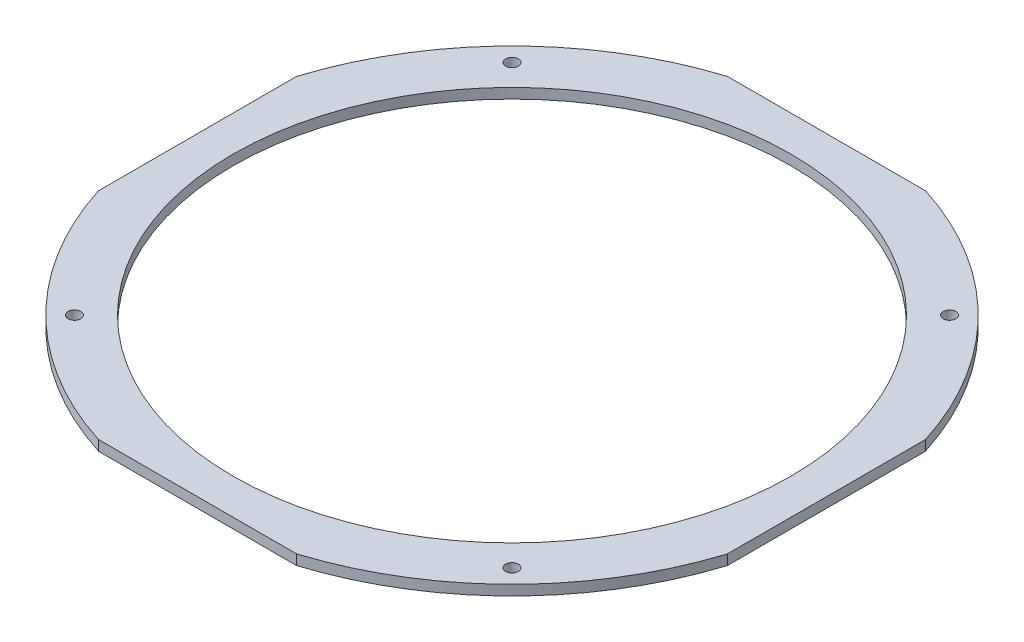
ISO-10303-21;
HEADER;
FILE_DESCRIPTION(('STEP AP214'),'2;1');
FILE_NAME('part.step','',(''),(''),'','','');
FILE_SCHEMA(('AUTOMOTIVE_DESIGN { 1 0 10303 214 1 1 1 1 }'));
ENDSEC;
DATA;
#1=APPLICATION_CONTEXT('core data for automotive mechanical design processes');
#2=APPLICATION_PROTOCOL_DEFINITION('international standard','automotive_design',2000,#1);
#3=PRODUCT_CONTEXT('',#1,'mechanical');
#4=PRODUCT('Part','Part','',(#3));
#5=PRODUCT_RELATED_PRODUCT_CATEGORY('part','',(#4));
#6=PRODUCT_DEFINITION_FORMATION('','',#4);
#7=PRODUCT_DEFINITION_CONTEXT('part definition',#1,'design');
#8=PRODUCT_DEFINITION('design','',#6,#7);
#9=PRODUCT_DEFINITION_SHAPE('','',#8);
#10=(LENGTH_UNIT() NAMED_UNIT(*) SI_UNIT(.MILLI.,.METRE.));
#11=(NAMED_UNIT(*) PLANE_ANGLE_UNIT() SI_UNIT($,.RADIAN.));
#12=(NAMED_UNIT(*) SI_UNIT($,.STERADIAN.) SOLID_ANGLE_UNIT());
#13=UNCERTAINTY_MEASURE_WITH_UNIT(LENGTH_MEASURE(1.E-05),#10,'distance_accuracy_value','');
#14=(GEOMETRIC_REPRESENTATION_CONTEXT(3) GLOBAL_UNCERTAINTY_ASSIGNED_CONTEXT((#13)) GLOBAL_UNIT_ASSIGNED_CONTEXT((#10,
#11,#12)) REPRESENTATION_CONTEXT('',''));
#15=CARTESIAN_POINT('',(0.,0.,0.));
#16=DIRECTION('',(0.,0.,1.));
#17=DIRECTION('',(1.,0.,0.));
#18=AXIS2_PLACEMENT_3D('',#15,#16,#17);
#19=CARTESIAN_POINT('',(0.,2.,0.));
#20=DIRECTION('',(0.,1.,0.));
#21=DIRECTION('',(0.,0.,1.));
#22=AXIS2_PLACEMENT_3D('',#19,#20,#21);
#23=PLANE('',#22);
#24=CARTESIAN_POINT('',(43.1335136523798,2.,-43.1335136523789));
#25=DIRECTION('',(0.,1.,0.));
#26=DIRECTION('',(0.,0.,1.));
#27=AXIS2_PLACEMENT_3D('',#24,#25,#26);
#28=CIRCLE('',#27,1.25);
#29=CARTESIAN_POINT('',(43.1335136523798,2.,-41.8835136523789));
#30=VERTEX_POINT('',#29);
#31=EDGE_CURVE('E236',#30,#30,#28,.T.);
#32=ORIENTED_EDGE('',*,*,#31,.F.);
#33=EDGE_LOOP('',(#32));
#34=FACE_BOUND('',#33,.T.);
#35=CARTESIAN_POINT('',(-43.1335136523791,2.,-43.1335136523797));
#36=DIRECTION('',(0.,1.,0.));
#37=DIRECTION('',(0.,0.,1.));
#38=AXIS2_PLACEMENT_3D('',#35,#36,#37);
#39=CIRCLE('',#38,1.25);
#40=CARTESIAN_POINT('',(-43.1335136523791,2.,-41.8835136523797));
#41=VERTEX_POINT('',#40);
#42=EDGE_CURVE('E240',#41,#41,#39,.T.);
#43=ORIENTED_EDGE('',*,*,#42,.F.);
#44=EDGE_LOOP('',(#43));
#45=FACE_BOUND('',#44,.T.);
#46=CARTESIAN_POINT('',(-43.1335136523795,2.,43.1335136523792));
#47=DIRECTION('',(0.,1.,0.));
#48=DIRECTION('',(0.,0.,1.));
#49=AXIS2_PLACEMENT_3D('',#46,#47,#48);
#50=CIRCLE('',#49,1.25);
#51=CARTESIAN_POINT('',(-43.1335136523795,2.,44.3835136523792));
#52=VERTEX_POINT('',#51);
#53=EDGE_CURVE('E244',#52,#52,#50,.T.);
#54=ORIENTED_EDGE('',*,*,#53,.F.);
#55=EDGE_LOOP('',(#54));
#56=FACE_BOUND('',#55,.T.);
#57=CARTESIAN_POINT('',(43.1335136523794,2.,43.1335136523794));
#58=DIRECTION('',(0.,1.,0.));
#59=DIRECTION('',(0.,0.,1.));
#60=AXIS2_PLACEMENT_3D('',#57,#58,#59);
#61=CIRCLE('',#60,1.25);
#62=CARTESIAN_POINT('',(43.1335136523794,2.,44.3835136523794));
#63=VERTEX_POINT('',#62);
#64=EDGE_CURVE('E166',#63,#63,#61,.T.);
#65=ORIENTED_EDGE('',*,*,#64,.F.);
#66=EDGE_LOOP('',(#65));
#67=FACE_BOUND('',#66,.T.);
#68=CARTESIAN_POINT('',(0.,2.,0.));
#69=DIRECTION('',(0.,1.,0.));
#70=DIRECTION('',(0.,0.,1.));
#71=AXIS2_PLACEMENT_3D('',#68,#69,#70);
#72=CIRCLE('',#71,55.);
#73=CARTESIAN_POINT('',(0.,2.,55.));
#74=VERTEX_POINT('',#73);
#75=EDGE_CURVE('E199',#74,#74,#72,.T.);
#76=ORIENTED_EDGE('',*,*,#75,.F.);
#77=EDGE_LOOP('',(#76));
#78=FACE_BOUND('',#77,.T.);
#79=CARTESIAN_POINT('',(0.,2.,0.));
#80=DIRECTION('',(0.,1.,0.));
#81=DIRECTION('',(0.,0.,1.));
#82=AXIS2_PLACEMENT_3D('',#79,#80,#81);
#83=CIRCLE('',#82,65.);
#84=CARTESIAN_POINT('',(19.5192212959431,2.,62.));
#85=VERTEX_POINT('',#84);
#86=CARTESIAN_POINT('',(62.,2.,19.5192212959431));
#87=VERTEX_POINT('',#86);
#88=EDGE_CURVE('E131',#85,#87,#83,.T.);
#89=ORIENTED_EDGE('',*,*,#88,.T.);
#90=DIRECTION('',(0.,0.,-1.));
#91=VECTOR('',#90,1.);
#92=CARTESIAN_POINT('',(62.,2.,-62.));
#93=LINE('',#92,#91);
#94=CARTESIAN_POINT('',(62.,2.,-19.5192212959431));
#95=VERTEX_POINT('',#94);
#96=EDGE_CURVE('E115',#87,#95,#93,.T.);
#97=ORIENTED_EDGE('',*,*,#96,.T.);
#98=CARTESIAN_POINT('',(19.5192212959431,2.,-62.));
#99=VERTEX_POINT('',#98);
#100=EDGE_CURVE('E122',#95,#99,#83,.T.);
#101=ORIENTED_EDGE('',*,*,#100,.T.);
#102=DIRECTION('',(-1.,0.,0.));
#103=VECTOR('',#102,1.);
#104=CARTESIAN_POINT('',(-62.,2.,-62.));
#105=LINE('',#104,#103);
#106=CARTESIAN_POINT('',(-19.5192212959431,2.,-62.));
#107=VERTEX_POINT('',#106);
#108=EDGE_CURVE('E104',#99,#107,#105,.T.);
#109=ORIENTED_EDGE('',*,*,#108,.T.);
#110=CARTESIAN_POINT('',(-62.,2.,-19.5192212959431));
#111=VERTEX_POINT('',#110);
#112=EDGE_CURVE('E132',#107,#111,#83,.T.);
#113=ORIENTED_EDGE('',*,*,#112,.T.);
#114=DIRECTION('',(0.,0.,1.));
#115=VECTOR('',#114,1.);
#116=CARTESIAN_POINT('',(-62.,2.,-62.));
#117=LINE('',#116,#115);
#118=CARTESIAN_POINT('',(-62.,2.,19.5192212959431));
#119=VERTEX_POINT('',#118);
#120=EDGE_CURVE('E114',#111,#119,#117,.T.);
#121=ORIENTED_EDGE('',*,*,#120,.T.);
#122=CARTESIAN_POINT('',(-19.5192212959431,2.,62.));
#123=VERTEX_POINT('',#122);
#124=EDGE_CURVE('E136',#119,#123,#83,.T.);
#125=ORIENTED_EDGE('',*,*,#124,.T.);
#126=DIRECTION('',(1.,0.,0.));
#127=VECTOR('',#126,1.);
#128=CARTESIAN_POINT('',(-62.,2.,62.));
#129=LINE('',#128,#127);
#130=EDGE_CURVE('E186',#123,#85,#129,.T.);
#131=ORIENTED_EDGE('',*,*,#130,.T.);
#132=EDGE_LOOP('',(#89,#97,#101,#109,#113,#121,#125,#131));
#133=FACE_BOUND('',#132,.T.);
#134=ADVANCED_FACE('F39',(#34,#45,#56,#67,#78,#133),#23,.T.);
#135=CARTESIAN_POINT('',(0.,0.,0.));
#136=DIRECTION('',(0.,1.,0.));
#137=DIRECTION('',(0.,0.,1.));
#138=AXIS2_PLACEMENT_3D('',#135,#136,#137);
#139=PLANE('',#138);
#140=CARTESIAN_POINT('',(43.1335136523798,0.,-43.1335136523789));
#141=DIRECTION('',(0.,1.,0.));
#142=DIRECTION('',(0.,0.,1.));
#143=AXIS2_PLACEMENT_3D('',#140,#141,#142);
#144=CIRCLE('',#143,1.25);
#145=CARTESIAN_POINT('',(43.1335136523798,0.,-41.8835136523789));
#146=VERTEX_POINT('',#145);
#147=EDGE_CURVE('E43',#146,#146,#144,.T.);
#148=ORIENTED_EDGE('',*,*,#147,.T.);
#149=EDGE_LOOP('',(#148));
#150=FACE_BOUND('',#149,.T.);
#151=CARTESIAN_POINT('',(-43.1335136523791,0.,-43.1335136523797));
#152=DIRECTION('',(0.,1.,0.));
#153=DIRECTION('',(0.,0.,1.));
#154=AXIS2_PLACEMENT_3D('',#151,#152,#153);
#155=CIRCLE('',#154,1.25);
#156=CARTESIAN_POINT('',(-43.1335136523791,0.,-41.8835136523797));
#157=VERTEX_POINT('',#156);
#158=EDGE_CURVE('E169',#157,#157,#155,.T.);
#159=ORIENTED_EDGE('',*,*,#158,.T.);
#160=EDGE_LOOP('',(#159));
#161=FACE_BOUND('',#160,.T.);
#162=CARTESIAN_POINT('',(-43.1335136523795,0.,43.1335136523792));
#163=DIRECTION('',(0.,1.,0.));
#164=DIRECTION('',(0.,0.,1.));
#165=AXIS2_PLACEMENT_3D('',#162,#163,#164);
#166=CIRCLE('',#165,1.25);
#167=CARTESIAN_POINT('',(-43.1335136523795,0.,44.3835136523792));
#168=VERTEX_POINT('',#167);
#169=EDGE_CURVE('E165',#168,#168,#166,.T.);
#170=ORIENTED_EDGE('',*,*,#169,.T.);
#171=EDGE_LOOP('',(#170));
#172=FACE_BOUND('',#171,.T.);
#173=CARTESIAN_POINT('',(43.1335136523794,0.,43.1335136523794));
#174=DIRECTION('',(0.,1.,0.));
#175=DIRECTION('',(0.,0.,1.));
#176=AXIS2_PLACEMENT_3D('',#173,#174,#175);
#177=CIRCLE('',#176,1.25);
#178=CARTESIAN_POINT('',(43.1335136523794,0.,44.3835136523794));
#179=VERTEX_POINT('',#178);
#180=EDGE_CURVE('E161',#179,#179,#177,.T.);
#181=ORIENTED_EDGE('',*,*,#180,.T.);
#182=EDGE_LOOP('',(#181));
#183=FACE_BOUND('',#182,.T.);
#184=CARTESIAN_POINT('',(0.,0.,0.));
#185=DIRECTION('',(0.,1.,0.));
#186=DIRECTION('',(0.,0.,1.));
#187=AXIS2_PLACEMENT_3D('',#184,#185,#186);
#188=CIRCLE('',#187,55.);
#189=CARTESIAN_POINT('',(0.,0.,55.));
#190=VERTEX_POINT('',#189);
#191=EDGE_CURVE('E139',#190,#190,#188,.T.);
#192=ORIENTED_EDGE('',*,*,#191,.T.);
#193=EDGE_LOOP('',(#192));
#194=FACE_BOUND('',#193,.T.);
#195=DIRECTION('',(0.,0.,-1.));
#196=VECTOR('',#195,1.);
#197=CARTESIAN_POINT('',(62.,0.,0.));
#198=LINE('',#197,#196);
#199=CARTESIAN_POINT('',(62.,0.,19.5192212959432));
#200=VERTEX_POINT('',#199);
#201=CARTESIAN_POINT('',(62.,0.,-19.5192212959432));
#202=VERTEX_POINT('',#201);
#203=EDGE_CURVE('E197',#200,#202,#198,.T.);
#204=ORIENTED_EDGE('',*,*,#203,.F.);
#205=CARTESIAN_POINT('',(0.,0.,0.));
#206=DIRECTION('',(0.,1.,0.));
#207=DIRECTION('',(0.,0.,1.));
#208=AXIS2_PLACEMENT_3D('',#205,#206,#207);
#209=CIRCLE('',#208,65.);
#210=CARTESIAN_POINT('',(19.5192212959432,0.,62.));
#211=VERTEX_POINT('',#210);
#212=EDGE_CURVE('E141',#211,#200,#209,.T.);
#213=ORIENTED_EDGE('',*,*,#212,.F.);
#214=DIRECTION('',(1.,0.,0.));
#215=VECTOR('',#214,1.);
#216=CARTESIAN_POINT('',(0.,0.,62.));
#217=LINE('',#216,#215);
#218=CARTESIAN_POINT('',(-19.5192212959432,0.,62.));
#219=VERTEX_POINT('',#218);
#220=EDGE_CURVE('E194',#219,#211,#217,.T.);
#221=ORIENTED_EDGE('',*,*,#220,.F.);
#222=CARTESIAN_POINT('',(-62.,0.,19.5192212959432));
#223=VERTEX_POINT('',#222);
#224=EDGE_CURVE('E145',#223,#219,#209,.T.);
#225=ORIENTED_EDGE('',*,*,#224,.F.);
#226=DIRECTION('',(0.,0.,1.));
#227=VECTOR('',#226,1.);
#228=CARTESIAN_POINT('',(-62.,0.,0.));
#229=LINE('',#228,#227);
#230=CARTESIAN_POINT('',(-62.,0.,-19.5192212959432));
#231=VERTEX_POINT('',#230);
#232=EDGE_CURVE('E57',#231,#223,#229,.T.);
#233=ORIENTED_EDGE('',*,*,#232,.F.);
#234=CARTESIAN_POINT('',(-19.5192212959432,0.,-62.));
#235=VERTEX_POINT('',#234);
#236=EDGE_CURVE('E207',#235,#231,#209,.T.);
#237=ORIENTED_EDGE('',*,*,#236,.F.);
#238=DIRECTION('',(-1.,0.,0.));
#239=VECTOR('',#238,1.);
#240=CARTESIAN_POINT('',(0.,0.,-62.));
#241=LINE('',#240,#239);
#242=CARTESIAN_POINT('',(19.5192212959432,0.,-62.));
#243=VERTEX_POINT('',#242);
#244=EDGE_CURVE('E65',#243,#235,#241,.T.);
#245=ORIENTED_EDGE('',*,*,#244,.F.);
#246=EDGE_CURVE('E124',#202,#243,#209,.T.);
#247=ORIENTED_EDGE('',*,*,#246,.F.);
#248=EDGE_LOOP('',(#204,#213,#221,#225,#233,#237,#245,#247));
#249=FACE_BOUND('',#248,.T.);
#250=ADVANCED_FACE('F211',(#150,#161,#172,#183,#194,#249),#139,.F.);
#251=CARTESIAN_POINT('',(0.,2.,0.));
#252=DIRECTION('',(0.,-1.,0.));
#253=DIRECTION('',(0.,0.,-1.));
#254=AXIS2_PLACEMENT_3D('',#251,#252,#253);
#255=CYLINDRICAL_SURFACE('',#254,65.);
#256=DIRECTION('',(0.,-1.,0.));
#257=VECTOR('',#256,1.);
#258=CARTESIAN_POINT('',(62.,2.,19.5192212959432));
#259=LINE('',#258,#257);
#260=EDGE_CURVE('E11',#87,#200,#259,.T.);
#261=ORIENTED_EDGE('',*,*,#260,.F.);
#262=ORIENTED_EDGE('',*,*,#88,.F.);
#263=DIRECTION('',(0.,-1.,0.));
#264=VECTOR('',#263,1.);
#265=CARTESIAN_POINT('',(19.5192212959432,2.,62.));
#266=LINE('',#265,#264);
#267=EDGE_CURVE('E153',#211,#85,#266,.F.);
#268=ORIENTED_EDGE('',*,*,#267,.F.);
#269=ORIENTED_EDGE('',*,*,#212,.T.);
#270=EDGE_LOOP('',(#261,#262,#268,#269));
#271=FACE_BOUND('',#270,.T.);
#272=ADVANCED_FACE('F41',(#271),#255,.T.);
#273=DIRECTION('',(0.,-1.,0.));
#274=VECTOR('',#273,1.);
#275=CARTESIAN_POINT('',(62.,2.,-19.5192212959432));
#276=LINE('',#275,#274);
#277=EDGE_CURVE('E49',#202,#95,#276,.F.);
#278=ORIENTED_EDGE('',*,*,#277,.F.);
#279=ORIENTED_EDGE('',*,*,#246,.T.);
#280=DIRECTION('',(0.,-1.,0.));
#281=VECTOR('',#280,1.);
#282=CARTESIAN_POINT('',(19.5192212959432,2.,-62.));
#283=LINE('',#282,#281);
#284=EDGE_CURVE('E107',#99,#243,#283,.T.);
#285=ORIENTED_EDGE('',*,*,#284,.F.);
#286=ORIENTED_EDGE('',*,*,#100,.F.);
#287=EDGE_LOOP('',(#278,#279,#285,#286));
#288=FACE_BOUND('',#287,.T.);
#289=ADVANCED_FACE('F121',(#288),#255,.T.);
#290=DIRECTION('',(0.,-1.,0.));
#291=VECTOR('',#290,1.);
#292=CARTESIAN_POINT('',(-19.5192212959432,2.,62.));
#293=LINE('',#292,#291);
#294=EDGE_CURVE('E156',#123,#219,#293,.T.);
#295=ORIENTED_EDGE('',*,*,#294,.F.);
#296=ORIENTED_EDGE('',*,*,#124,.F.);
#297=DIRECTION('',(0.,-1.,0.));
#298=VECTOR('',#297,1.);
#299=CARTESIAN_POINT('',(-62.,2.,19.5192212959432));
#300=LINE('',#299,#298);
#301=EDGE_CURVE('E126',#223,#119,#300,.F.);
#302=ORIENTED_EDGE('',*,*,#301,.F.);
#303=ORIENTED_EDGE('',*,*,#224,.T.);
#304=EDGE_LOOP('',(#295,#296,#302,#303));
#305=FACE_BOUND('',#304,.T.);
#306=ADVANCED_FACE('F224',(#305),#255,.T.);
#307=DIRECTION('',(0.,-1.,0.));
#308=VECTOR('',#307,1.);
#309=CARTESIAN_POINT('',(-62.,2.,-19.5192212959432));
#310=LINE('',#309,#308);
#311=EDGE_CURVE('E150',#111,#231,#310,.T.);
#312=ORIENTED_EDGE('',*,*,#311,.F.);
#313=ORIENTED_EDGE('',*,*,#112,.F.);
#314=DIRECTION('',(0.,-1.,0.));
#315=VECTOR('',#314,1.);
#316=CARTESIAN_POINT('',(-19.5192212959432,2.,-62.));
#317=LINE('',#316,#315);
#318=EDGE_CURVE('E108',#235,#107,#317,.F.);
#319=ORIENTED_EDGE('',*,*,#318,.F.);
#320=ORIENTED_EDGE('',*,*,#236,.T.);
#321=EDGE_LOOP('',(#312,#313,#319,#320));
#322=FACE_BOUND('',#321,.T.);
#323=ADVANCED_FACE('F216',(#322),#255,.T.);
#324=CARTESIAN_POINT('',(0.,2.,0.));
#325=DIRECTION('',(0.,-1.,0.));
#326=DIRECTION('',(0.,0.,-1.));
#327=AXIS2_PLACEMENT_3D('',#324,#325,#326);
#328=CYLINDRICAL_SURFACE('',#327,55.);
#329=ORIENTED_EDGE('',*,*,#75,.T.);
#330=EDGE_LOOP('',(#329));
#331=FACE_BOUND('',#330,.T.);
#332=ORIENTED_EDGE('',*,*,#191,.F.);
#333=EDGE_LOOP('',(#332));
#334=FACE_BOUND('',#333,.T.);
#335=ADVANCED_FACE('F214',(#331,#334),#328,.F.);
#336=CARTESIAN_POINT('',(-62.,-1.,-62.));
#337=DIRECTION('',(0.,0.,-1.));
#338=DIRECTION('',(-1.,0.,0.));
#339=AXIS2_PLACEMENT_3D('',#336,#337,#338);
#340=PLANE('',#339);
#341=ORIENTED_EDGE('',*,*,#284,.T.);
#342=ORIENTED_EDGE('',*,*,#244,.T.);
#343=ORIENTED_EDGE('',*,*,#318,.T.);
#344=ORIENTED_EDGE('',*,*,#108,.F.);
#345=EDGE_LOOP('',(#341,#342,#343,#344));
#346=FACE_BOUND('',#345,.T.);
#347=ADVANCED_FACE('F106',(#346),#340,.T.);
#348=CARTESIAN_POINT('',(-62.,-1.,-62.));
#349=DIRECTION('',(-1.,0.,0.));
#350=DIRECTION('',(0.,0.,1.));
#351=AXIS2_PLACEMENT_3D('',#348,#349,#350);
#352=PLANE('',#351);
#353=ORIENTED_EDGE('',*,*,#311,.T.);
#354=ORIENTED_EDGE('',*,*,#232,.T.);
#355=ORIENTED_EDGE('',*,*,#301,.T.);
#356=ORIENTED_EDGE('',*,*,#120,.F.);
#357=EDGE_LOOP('',(#353,#354,#355,#356));
#358=FACE_BOUND('',#357,.T.);
#359=ADVANCED_FACE('F222',(#358),#352,.T.);
#360=CARTESIAN_POINT('',(-62.,-1.,62.));
#361=DIRECTION('',(0.,0.,1.));
#362=DIRECTION('',(1.,0.,0.));
#363=AXIS2_PLACEMENT_3D('',#360,#361,#362);
#364=PLANE('',#363);
#365=ORIENTED_EDGE('',*,*,#294,.T.);
#366=ORIENTED_EDGE('',*,*,#220,.T.);
#367=ORIENTED_EDGE('',*,*,#267,.T.);
#368=ORIENTED_EDGE('',*,*,#130,.F.);
#369=EDGE_LOOP('',(#365,#366,#367,#368));
#370=FACE_BOUND('',#369,.T.);
#371=ADVANCED_FACE('F274',(#370),#364,.T.);
#372=CARTESIAN_POINT('',(62.,-1.,-62.));
#373=DIRECTION('',(1.,0.,0.));
#374=DIRECTION('',(0.,0.,-1.));
#375=AXIS2_PLACEMENT_3D('',#372,#373,#374);
#376=PLANE('',#375);
#377=ORIENTED_EDGE('',*,*,#260,.T.);
#378=ORIENTED_EDGE('',*,*,#203,.T.);
#379=ORIENTED_EDGE('',*,*,#277,.T.);
#380=ORIENTED_EDGE('',*,*,#96,.F.);
#381=EDGE_LOOP('',(#377,#378,#379,#380));
#382=FACE_BOUND('',#381,.T.);
#383=ADVANCED_FACE('F273',(#382),#376,.T.);
#384=CARTESIAN_POINT('',(43.1335136523794,-1.,43.1335136523794));
#385=DIRECTION('',(0.,1.,0.));
#386=DIRECTION('',(0.,0.,1.));
#387=AXIS2_PLACEMENT_3D('',#384,#385,#386);
#388=CYLINDRICAL_SURFACE('',#387,1.25);
#389=ORIENTED_EDGE('',*,*,#64,.T.);
#390=EDGE_LOOP('',(#389));
#391=FACE_BOUND('',#390,.T.);
#392=ORIENTED_EDGE('',*,*,#180,.F.);
#393=EDGE_LOOP('',(#392));
#394=FACE_BOUND('',#393,.T.);
#395=ADVANCED_FACE('F270',(#391,#394),#388,.F.);
#396=CARTESIAN_POINT('',(-43.1335136523795,-1.,43.1335136523792));
#397=DIRECTION('',(0.,1.,0.));
#398=DIRECTION('',(0.,0.,1.));
#399=AXIS2_PLACEMENT_3D('',#396,#397,#398);
#400=CYLINDRICAL_SURFACE('',#399,1.25);
#401=ORIENTED_EDGE('',*,*,#53,.T.);
#402=EDGE_LOOP('',(#401));
#403=FACE_BOUND('',#402,.T.);
#404=ORIENTED_EDGE('',*,*,#169,.F.);
#405=EDGE_LOOP('',(#404));
#406=FACE_BOUND('',#405,.T.);
#407=ADVANCED_FACE('F265',(#403,#406),#400,.F.);
#408=CARTESIAN_POINT('',(-43.1335136523791,-1.,-43.1335136523797));
#409=DIRECTION('',(0.,1.,0.));
#410=DIRECTION('',(0.,0.,1.));
#411=AXIS2_PLACEMENT_3D('',#408,#409,#410);
#412=CYLINDRICAL_SURFACE('',#411,1.25);
#413=ORIENTED_EDGE('',*,*,#42,.T.);
#414=EDGE_LOOP('',(#413));
#415=FACE_BOUND('',#414,.T.);
#416=ORIENTED_EDGE('',*,*,#158,.F.);
#417=EDGE_LOOP('',(#416));
#418=FACE_BOUND('',#417,.T.);
#419=ADVANCED_FACE('F260',(#415,#418),#412,.F.);
#420=CARTESIAN_POINT('',(43.1335136523798,-1.,-43.1335136523789));
#421=DIRECTION('',(0.,1.,0.));
#422=DIRECTION('',(0.,0.,1.));
#423=AXIS2_PLACEMENT_3D('',#420,#421,#422);
#424=CYLINDRICAL_SURFACE('',#423,1.25);
#425=ORIENTED_EDGE('',*,*,#31,.T.);
#426=EDGE_LOOP('',(#425));
#427=FACE_BOUND('',#426,.T.);
#428=ORIENTED_EDGE('',*,*,#147,.F.);
#429=EDGE_LOOP('',(#428));
#430=FACE_BOUND('',#429,.T.);
#431=ADVANCED_FACE('F257',(#427,#430),#424,.F.);
#432=CLOSED_SHELL('',(#134,#250,#272,#289,#306,#323,#335,#347,#359,#371,#383,#395,#407,#419,#431));
#433=MANIFOLD_SOLID_BREP('B2',#432);
#434=ADVANCED_BREP_SHAPE_REPRESENTATION('',(#18,#433),#14);
#435=SHAPE_DEFINITION_REPRESENTATION(#9,#434);
ENDSEC;
END-ISO-10303-21;
